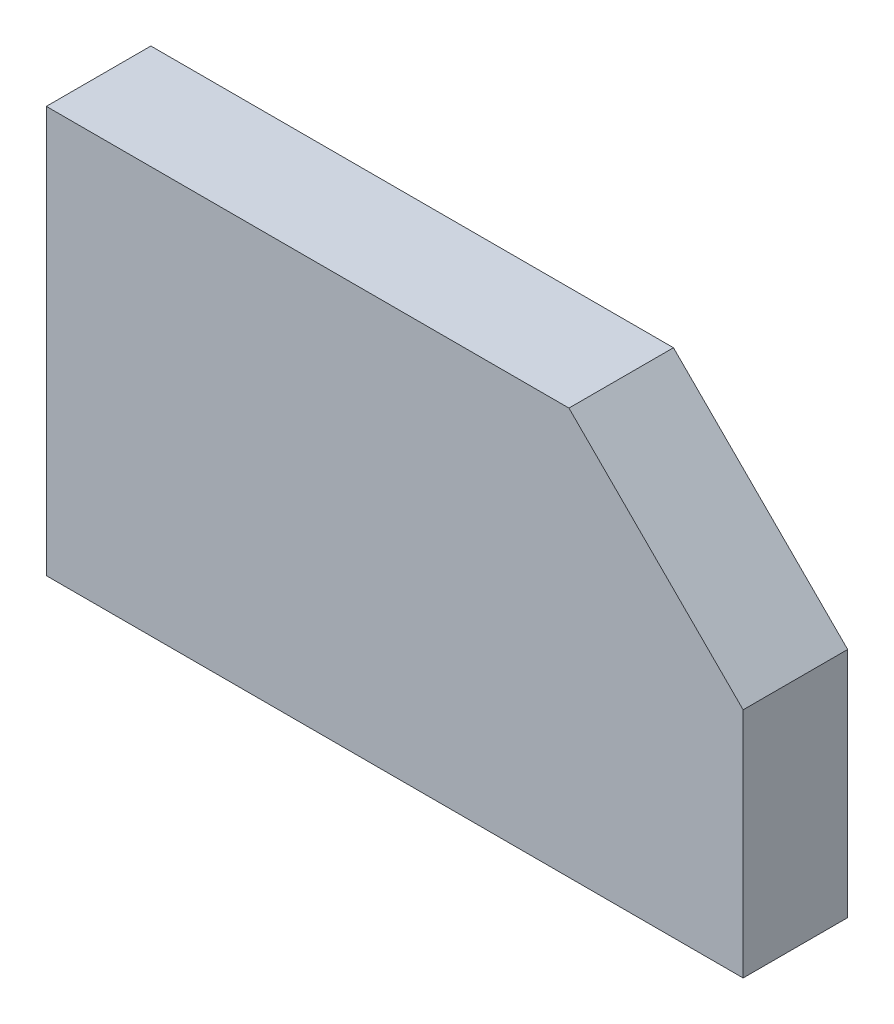
ISO-10303-21;
HEADER;
FILE_DESCRIPTION(('STEP AP214'),'2;1');
FILE_NAME('part.step','',(''),(''),'','','');
FILE_SCHEMA(('AUTOMOTIVE_DESIGN { 1 0 10303 214 1 1 1 1 }'));
ENDSEC;
DATA;
#1=APPLICATION_CONTEXT('core data for automotive mechanical design processes');
#2=APPLICATION_PROTOCOL_DEFINITION('international standard','automotive_design',2000,#1);
#3=PRODUCT_CONTEXT('',#1,'mechanical');
#4=PRODUCT('Part','Part','',(#3));
#5=PRODUCT_RELATED_PRODUCT_CATEGORY('part','',(#4));
#6=PRODUCT_DEFINITION_FORMATION('','',#4);
#7=PRODUCT_DEFINITION_CONTEXT('part definition',#1,'design');
#8=PRODUCT_DEFINITION('design','',#6,#7);
#9=PRODUCT_DEFINITION_SHAPE('','',#8);
#10=(LENGTH_UNIT() NAMED_UNIT(*) SI_UNIT(.MILLI.,.METRE.));
#11=(NAMED_UNIT(*) PLANE_ANGLE_UNIT() SI_UNIT($,.RADIAN.));
#12=(NAMED_UNIT(*) SI_UNIT($,.STERADIAN.) SOLID_ANGLE_UNIT());
#13=UNCERTAINTY_MEASURE_WITH_UNIT(LENGTH_MEASURE(1.E-05),#10,'distance_accuracy_value','');
#14=(GEOMETRIC_REPRESENTATION_CONTEXT(3) GLOBAL_UNCERTAINTY_ASSIGNED_CONTEXT((#13)) GLOBAL_UNIT_ASSIGNED_CONTEXT((#10,
#11,#12)) REPRESENTATION_CONTEXT('',''));
#15=CARTESIAN_POINT('',(0.,0.,0.));
#16=DIRECTION('',(0.,0.,1.));
#17=DIRECTION('',(1.,0.,0.));
#18=AXIS2_PLACEMENT_3D('',#15,#16,#17);
#19=CARTESIAN_POINT('',(60.,5.,18.));
#20=DIRECTION('',(-1.,0.,0.));
#21=DIRECTION('',(0.,-1.,0.));
#22=AXIS2_PLACEMENT_3D('',#19,#20,#21);
#23=PLANE('',#22);
#24=DIRECTION('',(0.,1.,0.));
#25=VECTOR('',#24,1.);
#26=CARTESIAN_POINT('',(60.,5.,0.));
#27=LINE('',#26,#25);
#28=CARTESIAN_POINT('',(60.,-35.,0.));
#29=VERTEX_POINT('',#28);
#30=CARTESIAN_POINT('',(60.,5.,0.));
#31=VERTEX_POINT('',#30);
#32=EDGE_CURVE('E110',#29,#31,#27,.T.);
#33=ORIENTED_EDGE('',*,*,#32,.T.);
#34=DIRECTION('',(0.,0.,-1.));
#35=VECTOR('',#34,1.);
#36=CARTESIAN_POINT('',(60.,5.,18.));
#37=LINE('',#36,#35);
#38=CARTESIAN_POINT('',(60.,5.,18.));
#39=VERTEX_POINT('',#38);
#40=EDGE_CURVE('E11',#39,#31,#37,.T.);
#41=ORIENTED_EDGE('',*,*,#40,.F.);
#42=DIRECTION('',(0.,1.,0.));
#43=VECTOR('',#42,1.);
#44=CARTESIAN_POINT('',(60.,5.,18.));
#45=LINE('',#44,#43);
#46=CARTESIAN_POINT('',(60.,-35.,18.));
#47=VERTEX_POINT('',#46);
#48=EDGE_CURVE('E119',#47,#39,#45,.T.);
#49=ORIENTED_EDGE('',*,*,#48,.F.);
#50=DIRECTION('',(0.,0.,-1.));
#51=VECTOR('',#50,1.);
#52=CARTESIAN_POINT('',(60.,-35.,18.));
#53=LINE('',#52,#51);
#54=EDGE_CURVE('E106',#47,#29,#53,.T.);
#55=ORIENTED_EDGE('',*,*,#54,.T.);
#56=EDGE_LOOP('',(#33,#41,#49,#55));
#57=FACE_BOUND('',#56,.T.);
#58=ADVANCED_FACE('F33',(#57),#23,.F.);
#59=CARTESIAN_POINT('',(30.,35.,18.));
#60=DIRECTION('',(-0.707106781186547,-0.707106781186547,0.));
#61=DIRECTION('',(0.707106781186548,-0.707106781186548,0.));
#62=AXIS2_PLACEMENT_3D('',#59,#60,#61);
#63=PLANE('',#62);
#64=DIRECTION('',(-0.707106781186547,0.707106781186547,0.));
#65=VECTOR('',#64,1.);
#66=CARTESIAN_POINT('',(30.,35.,0.));
#67=LINE('',#66,#65);
#68=CARTESIAN_POINT('',(30.,35.,0.));
#69=VERTEX_POINT('',#68);
#70=EDGE_CURVE('E113',#31,#69,#67,.T.);
#71=ORIENTED_EDGE('',*,*,#70,.T.);
#72=DIRECTION('',(0.,0.,-1.));
#73=VECTOR('',#72,1.);
#74=CARTESIAN_POINT('',(30.,35.,18.));
#75=LINE('',#74,#73);
#76=CARTESIAN_POINT('',(30.,35.,18.));
#77=VERTEX_POINT('',#76);
#78=EDGE_CURVE('E41',#77,#69,#75,.T.);
#79=ORIENTED_EDGE('',*,*,#78,.F.);
#80=DIRECTION('',(-0.707106781186547,0.707106781186547,0.));
#81=VECTOR('',#80,1.);
#82=CARTESIAN_POINT('',(30.,35.,18.));
#83=LINE('',#82,#81);
#84=EDGE_CURVE('E84',#39,#77,#83,.T.);
#85=ORIENTED_EDGE('',*,*,#84,.F.);
#86=ORIENTED_EDGE('',*,*,#40,.T.);
#87=EDGE_LOOP('',(#71,#79,#85,#86));
#88=FACE_BOUND('',#87,.T.);
#89=ADVANCED_FACE('F144',(#88),#63,.F.);
#90=CARTESIAN_POINT('',(-60.,35.,18.));
#91=DIRECTION('',(0.,-1.,0.));
#92=DIRECTION('',(0.,0.,-1.));
#93=AXIS2_PLACEMENT_3D('',#90,#91,#92);
#94=PLANE('',#93);
#95=DIRECTION('',(-1.,0.,0.));
#96=VECTOR('',#95,1.);
#97=CARTESIAN_POINT('',(-60.,35.,0.));
#98=LINE('',#97,#96);
#99=CARTESIAN_POINT('',(-60.,35.,0.));
#100=VERTEX_POINT('',#99);
#101=EDGE_CURVE('E101',#69,#100,#98,.T.);
#102=ORIENTED_EDGE('',*,*,#101,.T.);
#103=DIRECTION('',(0.,0.,-1.));
#104=VECTOR('',#103,1.);
#105=CARTESIAN_POINT('',(-60.,35.,18.));
#106=LINE('',#105,#104);
#107=CARTESIAN_POINT('',(-60.,35.,18.));
#108=VERTEX_POINT('',#107);
#109=EDGE_CURVE('E98',#108,#100,#106,.T.);
#110=ORIENTED_EDGE('',*,*,#109,.F.);
#111=DIRECTION('',(-1.,0.,0.));
#112=VECTOR('',#111,1.);
#113=CARTESIAN_POINT('',(-60.,35.,18.));
#114=LINE('',#113,#112);
#115=EDGE_CURVE('E90',#77,#108,#114,.T.);
#116=ORIENTED_EDGE('',*,*,#115,.F.);
#117=ORIENTED_EDGE('',*,*,#78,.T.);
#118=EDGE_LOOP('',(#102,#110,#116,#117));
#119=FACE_BOUND('',#118,.T.);
#120=ADVANCED_FACE('F99',(#119),#94,.F.);
#121=CARTESIAN_POINT('',(-60.,35.,18.));
#122=DIRECTION('',(1.,0.,0.));
#123=DIRECTION('',(0.,0.,-1.));
#124=AXIS2_PLACEMENT_3D('',#121,#122,#123);
#125=PLANE('',#124);
#126=CARTESIAN_POINT('',(-60.,16.,9.));
#127=DIRECTION('',(-1.,0.,0.));
#128=DIRECTION('',(0.,0.,1.));
#129=AXIS2_PLACEMENT_3D('',#126,#127,#128);
#130=CIRCLE('',#129,1.99999999999999);
#131=CARTESIAN_POINT('',(-60.,16.,11.));
#132=VERTEX_POINT('',#131);
#133=EDGE_CURVE('E272',#132,#132,#130,.T.);
#134=ORIENTED_EDGE('',*,*,#133,.F.);
#135=EDGE_LOOP('',(#134));
#136=FACE_BOUND('',#135,.T.);
#137=CARTESIAN_POINT('',(-60.,-16.,9.));
#138=DIRECTION('',(-1.,0.,0.));
#139=DIRECTION('',(0.,0.,1.));
#140=AXIS2_PLACEMENT_3D('',#137,#138,#139);
#141=CIRCLE('',#140,1.99999999999999);
#142=CARTESIAN_POINT('',(-60.,-16.,11.));
#143=VERTEX_POINT('',#142);
#144=EDGE_CURVE('E278',#143,#143,#141,.T.);
#145=ORIENTED_EDGE('',*,*,#144,.F.);
#146=EDGE_LOOP('',(#145));
#147=FACE_BOUND('',#146,.T.);
#148=DIRECTION('',(0.,-1.,0.));
#149=VECTOR('',#148,1.);
#150=CARTESIAN_POINT('',(-60.,35.,0.));
#151=LINE('',#150,#149);
#152=CARTESIAN_POINT('',(-60.,-35.,0.));
#153=VERTEX_POINT('',#152);
#154=EDGE_CURVE('E70',#100,#153,#151,.T.);
#155=ORIENTED_EDGE('',*,*,#154,.T.);
#156=DIRECTION('',(0.,0.,-1.));
#157=VECTOR('',#156,1.);
#158=CARTESIAN_POINT('',(-60.,-35.,18.));
#159=LINE('',#158,#157);
#160=CARTESIAN_POINT('',(-60.,-35.,18.));
#161=VERTEX_POINT('',#160);
#162=EDGE_CURVE('E102',#161,#153,#159,.T.);
#163=ORIENTED_EDGE('',*,*,#162,.F.);
#164=DIRECTION('',(0.,-1.,0.));
#165=VECTOR('',#164,1.);
#166=CARTESIAN_POINT('',(-60.,35.,18.));
#167=LINE('',#166,#165);
#168=EDGE_CURVE('E94',#108,#161,#167,.T.);
#169=ORIENTED_EDGE('',*,*,#168,.F.);
#170=ORIENTED_EDGE('',*,*,#109,.T.);
#171=EDGE_LOOP('',(#155,#163,#169,#170));
#172=FACE_BOUND('',#171,.T.);
#173=ADVANCED_FACE('F104',(#136,#147,#172),#125,.F.);
#174=CARTESIAN_POINT('',(-60.,-35.,18.));
#175=DIRECTION('',(0.,1.,0.));
#176=DIRECTION('',(0.,0.,1.));
#177=AXIS2_PLACEMENT_3D('',#174,#175,#176);
#178=PLANE('',#177);
#179=CARTESIAN_POINT('',(35.,-35.,9.00000000000015));
#180=DIRECTION('',(0.,-1.,0.));
#181=DIRECTION('',(0.,0.,-1.));
#182=AXIS2_PLACEMENT_3D('',#179,#180,#181);
#183=CIRCLE('',#182,1.99999999999999);
#184=CARTESIAN_POINT('',(35.,-35.,7.00000000000017));
#185=VERTEX_POINT('',#184);
#186=EDGE_CURVE('E262',#185,#185,#183,.T.);
#187=ORIENTED_EDGE('',*,*,#186,.F.);
#188=EDGE_LOOP('',(#187));
#189=FACE_BOUND('',#188,.T.);
#190=CARTESIAN_POINT('',(-20.,-35.,9.00000000000015));
#191=DIRECTION('',(0.,-1.,0.));
#192=DIRECTION('',(0.,0.,-1.));
#193=AXIS2_PLACEMENT_3D('',#190,#191,#192);
#194=CIRCLE('',#193,1.99999999999999);
#195=CARTESIAN_POINT('',(-20.,-35.,7.00000000000017));
#196=VERTEX_POINT('',#195);
#197=EDGE_CURVE('E264',#196,#196,#194,.T.);
#198=ORIENTED_EDGE('',*,*,#197,.F.);
#199=EDGE_LOOP('',(#198));
#200=FACE_BOUND('',#199,.T.);
#201=DIRECTION('',(1.,0.,0.));
#202=VECTOR('',#201,1.);
#203=CARTESIAN_POINT('',(-60.,-35.,0.));
#204=LINE('',#203,#202);
#205=EDGE_CURVE('E76',#153,#29,#204,.T.);
#206=ORIENTED_EDGE('',*,*,#205,.T.);
#207=ORIENTED_EDGE('',*,*,#54,.F.);
#208=DIRECTION('',(1.,0.,0.));
#209=VECTOR('',#208,1.);
#210=CARTESIAN_POINT('',(-60.,-35.,18.));
#211=LINE('',#210,#209);
#212=EDGE_CURVE('E49',#161,#47,#211,.T.);
#213=ORIENTED_EDGE('',*,*,#212,.F.);
#214=ORIENTED_EDGE('',*,*,#162,.T.);
#215=EDGE_LOOP('',(#206,#207,#213,#214));
#216=FACE_BOUND('',#215,.T.);
#217=ADVANCED_FACE('F127',(#189,#200,#216),#178,.F.);
#218=CARTESIAN_POINT('',(0.,0.,18.));
#219=DIRECTION('',(0.,0.,1.));
#220=DIRECTION('',(1.,0.,0.));
#221=AXIS2_PLACEMENT_3D('',#218,#219,#220);
#222=PLANE('',#221);
#223=ORIENTED_EDGE('',*,*,#48,.T.);
#224=ORIENTED_EDGE('',*,*,#84,.T.);
#225=ORIENTED_EDGE('',*,*,#115,.T.);
#226=ORIENTED_EDGE('',*,*,#168,.T.);
#227=ORIENTED_EDGE('',*,*,#212,.T.);
#228=EDGE_LOOP('',(#223,#224,#225,#226,#227));
#229=FACE_BOUND('',#228,.T.);
#230=ADVANCED_FACE('F92',(#229),#222,.T.);
#231=CARTESIAN_POINT('',(0.,0.,0.));
#232=DIRECTION('',(0.,0.,1.));
#233=DIRECTION('',(1.,0.,0.));
#234=AXIS2_PLACEMENT_3D('',#231,#232,#233);
#235=PLANE('',#234);
#236=ORIENTED_EDGE('',*,*,#32,.F.);
#237=ORIENTED_EDGE('',*,*,#205,.F.);
#238=ORIENTED_EDGE('',*,*,#154,.F.);
#239=ORIENTED_EDGE('',*,*,#101,.F.);
#240=ORIENTED_EDGE('',*,*,#70,.F.);
#241=EDGE_LOOP('',(#236,#237,#238,#239,#240));
#242=FACE_BOUND('',#241,.T.);
#243=ADVANCED_FACE('F123',(#242),#235,.F.);
#244=CARTESIAN_POINT('',(-30.,-16.,9.));
#245=DIRECTION('',(-1.,0.,0.));
#246=DIRECTION('',(0.,0.,1.));
#247=AXIS2_PLACEMENT_3D('',#244,#245,#246);
#248=CONICAL_SURFACE('',#247,1.99999999999999,1.02974425867665);
#249=CARTESIAN_POINT('',(-28.7982787619449,-16.,9.));
#250=VERTEX_POINT('',#249);
#251=VERTEX_LOOP('',#250);
#252=FACE_BOUND('',#251,.T.);
#253=CARTESIAN_POINT('',(-30.,-16.,9.));
#254=DIRECTION('',(-1.,0.,0.));
#255=DIRECTION('',(0.,0.,1.));
#256=AXIS2_PLACEMENT_3D('',#253,#254,#255);
#257=CIRCLE('',#256,1.99999999999999);
#258=CARTESIAN_POINT('',(-30.,-16.,11.));
#259=VERTEX_POINT('',#258);
#260=EDGE_CURVE('E114',#259,#259,#257,.T.);
#261=ORIENTED_EDGE('',*,*,#260,.T.);
#262=EDGE_LOOP('',(#261));
#263=FACE_BOUND('',#262,.T.);
#264=ADVANCED_FACE('F175',(#252,#263),#248,.F.);
#265=CARTESIAN_POINT('',(-60.,-16.,9.));
#266=DIRECTION('',(-1.,0.,0.));
#267=DIRECTION('',(0.,0.,1.));
#268=AXIS2_PLACEMENT_3D('',#265,#266,#267);
#269=CYLINDRICAL_SURFACE('',#268,1.99999999999999);
#270=ORIENTED_EDGE('',*,*,#260,.F.);
#271=EDGE_LOOP('',(#270));
#272=FACE_BOUND('',#271,.T.);
#273=ORIENTED_EDGE('',*,*,#144,.T.);
#274=EDGE_LOOP('',(#273));
#275=FACE_BOUND('',#274,.T.);
#276=ADVANCED_FACE('F180',(#272,#275),#269,.F.);
#277=CARTESIAN_POINT('',(-30.,16.,9.));
#278=DIRECTION('',(-1.,0.,0.));
#279=DIRECTION('',(0.,0.,1.));
#280=AXIS2_PLACEMENT_3D('',#277,#278,#279);
#281=CONICAL_SURFACE('',#280,1.99999999999999,1.02974425867665);
#282=CARTESIAN_POINT('',(-28.7982787619449,16.,9.));
#283=VERTEX_POINT('',#282);
#284=VERTEX_LOOP('',#283);
#285=FACE_BOUND('',#284,.T.);
#286=CARTESIAN_POINT('',(-30.,16.,9.));
#287=DIRECTION('',(-1.,0.,0.));
#288=DIRECTION('',(0.,0.,1.));
#289=AXIS2_PLACEMENT_3D('',#286,#287,#288);
#290=CIRCLE('',#289,1.99999999999999);
#291=CARTESIAN_POINT('',(-30.,16.,11.));
#292=VERTEX_POINT('',#291);
#293=EDGE_CURVE('E275',#292,#292,#290,.T.);
#294=ORIENTED_EDGE('',*,*,#293,.T.);
#295=EDGE_LOOP('',(#294));
#296=FACE_BOUND('',#295,.T.);
#297=ADVANCED_FACE('F188',(#285,#296),#281,.F.);
#298=CARTESIAN_POINT('',(-60.,16.,9.));
#299=DIRECTION('',(-1.,0.,0.));
#300=DIRECTION('',(0.,0.,1.));
#301=AXIS2_PLACEMENT_3D('',#298,#299,#300);
#302=CYLINDRICAL_SURFACE('',#301,1.99999999999999);
#303=ORIENTED_EDGE('',*,*,#293,.F.);
#304=EDGE_LOOP('',(#303));
#305=FACE_BOUND('',#304,.T.);
#306=ORIENTED_EDGE('',*,*,#133,.T.);
#307=EDGE_LOOP('',(#306));
#308=FACE_BOUND('',#307,.T.);
#309=ADVANCED_FACE('F196',(#305,#308),#302,.F.);
#310=CARTESIAN_POINT('',(-20.,-5.,9.00000000000015));
#311=DIRECTION('',(0.,-1.,0.));
#312=DIRECTION('',(0.,0.,-1.));
#313=AXIS2_PLACEMENT_3D('',#310,#311,#312);
#314=CONICAL_SURFACE('',#313,1.99999999999999,1.02974425867665);
#315=CARTESIAN_POINT('',(-20.,-3.79827876194488,9.00000000000015));
#316=VERTEX_POINT('',#315);
#317=VERTEX_LOOP('',#316);
#318=FACE_BOUND('',#317,.T.);
#319=CARTESIAN_POINT('',(-20.,-5.,9.00000000000015));
#320=DIRECTION('',(0.,-1.,0.));
#321=DIRECTION('',(0.,0.,-1.));
#322=AXIS2_PLACEMENT_3D('',#319,#320,#321);
#323=CIRCLE('',#322,1.99999999999999);
#324=CARTESIAN_POINT('',(-20.,-5.,7.00000000000016));
#325=VERTEX_POINT('',#324);
#326=EDGE_CURVE('E269',#325,#325,#323,.T.);
#327=ORIENTED_EDGE('',*,*,#326,.T.);
#328=EDGE_LOOP('',(#327));
#329=FACE_BOUND('',#328,.T.);
#330=ADVANCED_FACE('F203',(#318,#329),#314,.F.);
#331=CARTESIAN_POINT('',(-20.,-35.,9.00000000000015));
#332=DIRECTION('',(0.,-1.,0.));
#333=DIRECTION('',(0.,0.,-1.));
#334=AXIS2_PLACEMENT_3D('',#331,#332,#333);
#335=CYLINDRICAL_SURFACE('',#334,1.99999999999999);
#336=ORIENTED_EDGE('',*,*,#326,.F.);
#337=EDGE_LOOP('',(#336));
#338=FACE_BOUND('',#337,.T.);
#339=ORIENTED_EDGE('',*,*,#197,.T.);
#340=EDGE_LOOP('',(#339));
#341=FACE_BOUND('',#340,.T.);
#342=ADVANCED_FACE('F210',(#338,#341),#335,.F.);
#343=CARTESIAN_POINT('',(35.,-5.,9.00000000000015));
#344=DIRECTION('',(0.,-1.,0.));
#345=DIRECTION('',(0.,0.,-1.));
#346=AXIS2_PLACEMENT_3D('',#343,#344,#345);
#347=CONICAL_SURFACE('',#346,1.99999999999999,1.02974425867665);
#348=CARTESIAN_POINT('',(35.,-3.79827876194488,9.00000000000015));
#349=VERTEX_POINT('',#348);
#350=VERTEX_LOOP('',#349);
#351=FACE_BOUND('',#350,.T.);
#352=CARTESIAN_POINT('',(35.,-5.,9.00000000000015));
#353=DIRECTION('',(0.,-1.,0.));
#354=DIRECTION('',(0.,0.,-1.));
#355=AXIS2_PLACEMENT_3D('',#352,#353,#354);
#356=CIRCLE('',#355,1.99999999999999);
#357=CARTESIAN_POINT('',(35.,-5.,7.00000000000016));
#358=VERTEX_POINT('',#357);
#359=EDGE_CURVE('E260',#358,#358,#356,.T.);
#360=ORIENTED_EDGE('',*,*,#359,.T.);
#361=EDGE_LOOP('',(#360));
#362=FACE_BOUND('',#361,.T.);
#363=ADVANCED_FACE('F218',(#351,#362),#347,.F.);
#364=CARTESIAN_POINT('',(35.,-35.,9.00000000000015));
#365=DIRECTION('',(0.,-1.,0.));
#366=DIRECTION('',(0.,0.,-1.));
#367=AXIS2_PLACEMENT_3D('',#364,#365,#366);
#368=CYLINDRICAL_SURFACE('',#367,1.99999999999999);
#369=ORIENTED_EDGE('',*,*,#359,.F.);
#370=EDGE_LOOP('',(#369));
#371=FACE_BOUND('',#370,.T.);
#372=ORIENTED_EDGE('',*,*,#186,.T.);
#373=EDGE_LOOP('',(#372));
#374=FACE_BOUND('',#373,.T.);
#375=ADVANCED_FACE('F226',(#371,#374),#368,.F.);
#376=CLOSED_SHELL('',(#58,#89,#120,#173,#217,#230,#243,#264,#276,#297,#309,#330,#342,#363,#375));
#377=MANIFOLD_SOLID_BREP('B2',#376);
#378=ADVANCED_BREP_SHAPE_REPRESENTATION('',(#18,#377),#14);
#379=SHAPE_DEFINITION_REPRESENTATION(#9,#378);
ENDSEC;
END-ISO-10303-21;
